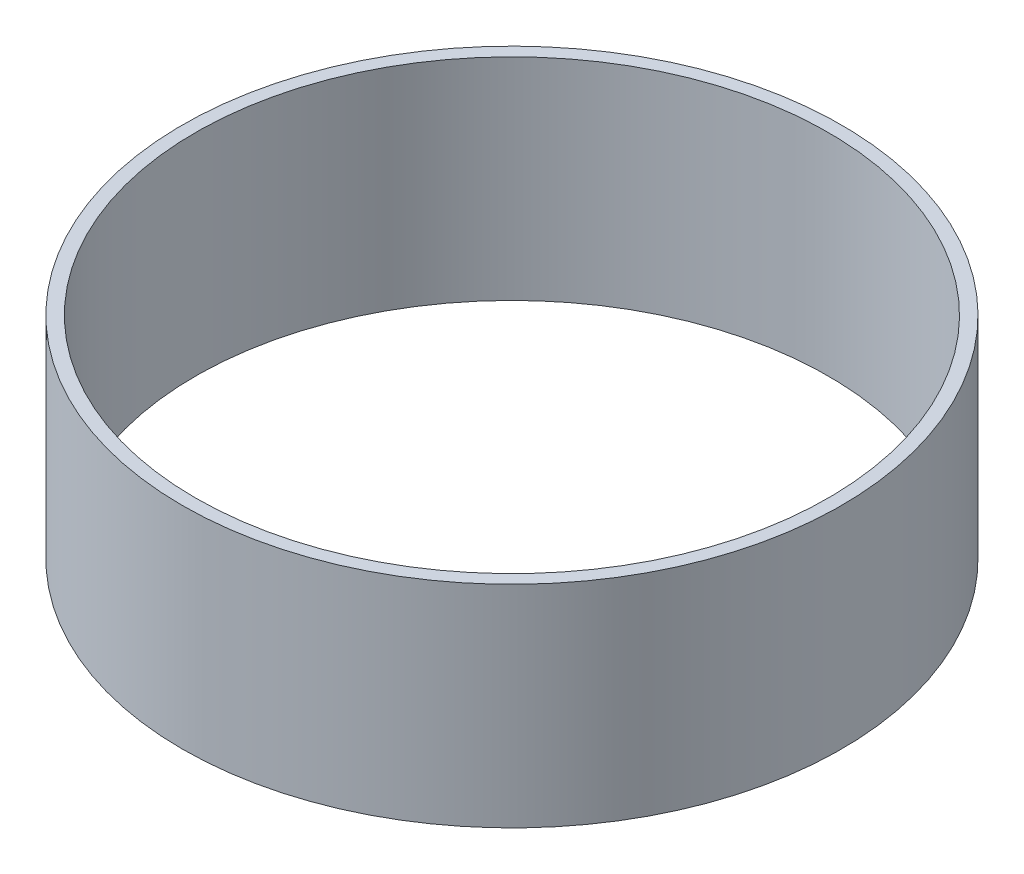
ISO-10303-21;
HEADER;
FILE_DESCRIPTION(('STEP AP214'),'2;1');
FILE_NAME('part.step','',(''),(''),'','','');
FILE_SCHEMA(('AUTOMOTIVE_DESIGN { 1 0 10303 214 1 1 1 1 }'));
ENDSEC;
DATA;
#1=APPLICATION_CONTEXT('core data for automotive mechanical design processes');
#2=APPLICATION_PROTOCOL_DEFINITION('international standard','automotive_design',2000,#1);
#3=PRODUCT_CONTEXT('',#1,'mechanical');
#4=PRODUCT('Part','Part','',(#3));
#5=PRODUCT_RELATED_PRODUCT_CATEGORY('part','',(#4));
#6=PRODUCT_DEFINITION_FORMATION('','',#4);
#7=PRODUCT_DEFINITION_CONTEXT('part definition',#1,'design');
#8=PRODUCT_DEFINITION('design','',#6,#7);
#9=PRODUCT_DEFINITION_SHAPE('','',#8);
#10=(LENGTH_UNIT() NAMED_UNIT(*) SI_UNIT(.MILLI.,.METRE.));
#11=(NAMED_UNIT(*) PLANE_ANGLE_UNIT() SI_UNIT($,.RADIAN.));
#12=(NAMED_UNIT(*) SI_UNIT($,.STERADIAN.) SOLID_ANGLE_UNIT());
#13=UNCERTAINTY_MEASURE_WITH_UNIT(LENGTH_MEASURE(1.E-05),#10,'distance_accuracy_value','');
#14=(GEOMETRIC_REPRESENTATION_CONTEXT(3) GLOBAL_UNCERTAINTY_ASSIGNED_CONTEXT((#13)) GLOBAL_UNIT_ASSIGNED_CONTEXT((#10,
#11,#12)) REPRESENTATION_CONTEXT('',''));
#15=CARTESIAN_POINT('',(0.,0.,0.));
#16=DIRECTION('',(0.,0.,1.));
#17=DIRECTION('',(1.,0.,0.));
#18=AXIS2_PLACEMENT_3D('',#15,#16,#17);
#19=CARTESIAN_POINT('',(0.,12.7,0.));
#20=DIRECTION('',(0.,1.,0.));
#21=DIRECTION('',(0.,0.,1.));
#22=AXIS2_PLACEMENT_3D('',#19,#20,#21);
#23=PLANE('',#22);
#24=CARTESIAN_POINT('',(0.,12.7,0.));
#25=DIRECTION('',(0.,1.,0.));
#26=DIRECTION('',(0.,0.,1.));
#27=AXIS2_PLACEMENT_3D('',#24,#25,#26);
#28=CIRCLE('',#27,39.6748);
#29=CARTESIAN_POINT('',(0.,12.7,39.6748));
#30=VERTEX_POINT('',#29);
#31=EDGE_CURVE('E10',#30,#30,#28,.T.);
#32=ORIENTED_EDGE('',*,*,#31,.T.);
#33=EDGE_LOOP('',(#32));
#34=FACE_BOUND('',#33,.T.);
#35=CARTESIAN_POINT('',(0.,12.7,0.));
#36=DIRECTION('',(0.,1.,0.));
#37=DIRECTION('',(0.,0.,1.));
#38=AXIS2_PLACEMENT_3D('',#35,#36,#37);
#39=CIRCLE('',#38,38.1);
#40=CARTESIAN_POINT('',(0.,12.7,38.1));
#41=VERTEX_POINT('',#40);
#42=EDGE_CURVE('E48',#41,#41,#39,.T.);
#43=ORIENTED_EDGE('',*,*,#42,.F.);
#44=EDGE_LOOP('',(#43));
#45=FACE_BOUND('',#44,.T.);
#46=ADVANCED_FACE('F37',(#34,#45),#23,.T.);
#47=CARTESIAN_POINT('',(0.,-12.7,0.));
#48=DIRECTION('',(0.,1.,0.));
#49=DIRECTION('',(0.,0.,1.));
#50=AXIS2_PLACEMENT_3D('',#47,#48,#49);
#51=PLANE('',#50);
#52=CARTESIAN_POINT('',(0.,-12.7,0.));
#53=DIRECTION('',(0.,1.,0.));
#54=DIRECTION('',(0.,0.,1.));
#55=AXIS2_PLACEMENT_3D('',#52,#53,#54);
#56=CIRCLE('',#55,39.6748);
#57=CARTESIAN_POINT('',(0.,-12.7,39.6748));
#58=VERTEX_POINT('',#57);
#59=EDGE_CURVE('E41',#58,#58,#56,.T.);
#60=ORIENTED_EDGE('',*,*,#59,.F.);
#61=EDGE_LOOP('',(#60));
#62=FACE_BOUND('',#61,.T.);
#63=CARTESIAN_POINT('',(0.,-12.7,0.));
#64=DIRECTION('',(0.,1.,0.));
#65=DIRECTION('',(0.,0.,1.));
#66=AXIS2_PLACEMENT_3D('',#63,#64,#65);
#67=CIRCLE('',#66,38.1);
#68=CARTESIAN_POINT('',(0.,-12.7,38.1));
#69=VERTEX_POINT('',#68);
#70=EDGE_CURVE('E50',#69,#69,#67,.T.);
#71=ORIENTED_EDGE('',*,*,#70,.T.);
#72=EDGE_LOOP('',(#71));
#73=FACE_BOUND('',#72,.T.);
#74=ADVANCED_FACE('F60',(#62,#73),#51,.F.);
#75=CARTESIAN_POINT('',(0.,12.7,0.));
#76=DIRECTION('',(0.,-1.,0.));
#77=DIRECTION('',(0.,0.,-1.));
#78=AXIS2_PLACEMENT_3D('',#75,#76,#77);
#79=CYLINDRICAL_SURFACE('',#78,39.6748);
#80=ORIENTED_EDGE('',*,*,#31,.F.);
#81=EDGE_LOOP('',(#80));
#82=FACE_BOUND('',#81,.T.);
#83=ORIENTED_EDGE('',*,*,#59,.T.);
#84=EDGE_LOOP('',(#83));
#85=FACE_BOUND('',#84,.T.);
#86=ADVANCED_FACE('F39',(#82,#85),#79,.T.);
#87=CARTESIAN_POINT('',(0.,12.7,0.));
#88=DIRECTION('',(0.,-1.,0.));
#89=DIRECTION('',(0.,0.,-1.));
#90=AXIS2_PLACEMENT_3D('',#87,#88,#89);
#91=CYLINDRICAL_SURFACE('',#90,38.1);
#92=ORIENTED_EDGE('',*,*,#42,.T.);
#93=EDGE_LOOP('',(#92));
#94=FACE_BOUND('',#93,.T.);
#95=ORIENTED_EDGE('',*,*,#70,.F.);
#96=EDGE_LOOP('',(#95));
#97=FACE_BOUND('',#96,.T.);
#98=ADVANCED_FACE('F56',(#94,#97),#91,.F.);
#99=CLOSED_SHELL('',(#46,#74,#86,#98));
#100=MANIFOLD_SOLID_BREP('B2',#99);
#101=ADVANCED_BREP_SHAPE_REPRESENTATION('',(#18,#100),#14);
#102=SHAPE_DEFINITION_REPRESENTATION(#9,#101);
ENDSEC;
END-ISO-10303-21;
